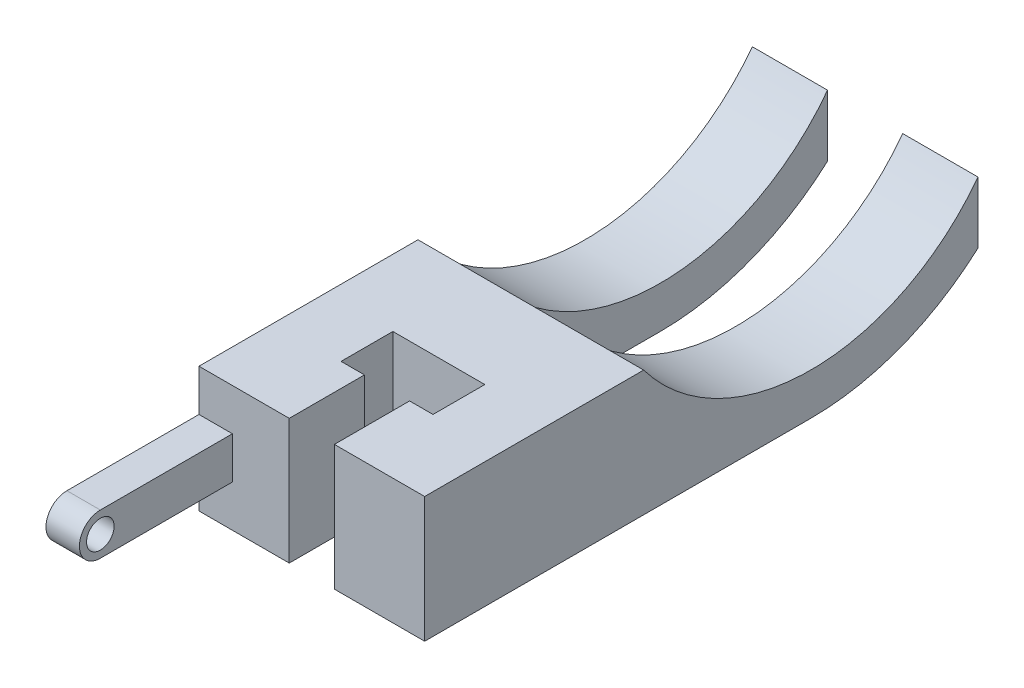
ISO-10303-21;
HEADER;
FILE_DESCRIPTION(('STEP AP214'),'2;1');
FILE_NAME('part.step','',(''),(''),'','','');
FILE_SCHEMA(('AUTOMOTIVE_DESIGN { 1 0 10303 214 1 1 1 1 }'));
ENDSEC;
DATA;
#1=APPLICATION_CONTEXT('core data for automotive mechanical design processes');
#2=APPLICATION_PROTOCOL_DEFINITION('international standard','automotive_design',2000,#1);
#3=PRODUCT_CONTEXT('',#1,'mechanical');
#4=PRODUCT('Part','Part','',(#3));
#5=PRODUCT_RELATED_PRODUCT_CATEGORY('part','',(#4));
#6=PRODUCT_DEFINITION_FORMATION('','',#4);
#7=PRODUCT_DEFINITION_CONTEXT('part definition',#1,'design');
#8=PRODUCT_DEFINITION('design','',#6,#7);
#9=PRODUCT_DEFINITION_SHAPE('','',#8);
#10=(LENGTH_UNIT() NAMED_UNIT(*) SI_UNIT(.MILLI.,.METRE.));
#11=(NAMED_UNIT(*) PLANE_ANGLE_UNIT() SI_UNIT($,.RADIAN.));
#12=(NAMED_UNIT(*) SI_UNIT($,.STERADIAN.) SOLID_ANGLE_UNIT());
#13=UNCERTAINTY_MEASURE_WITH_UNIT(LENGTH_MEASURE(1.E-05),#10,'distance_accuracy_value','');
#14=(GEOMETRIC_REPRESENTATION_CONTEXT(3) GLOBAL_UNCERTAINTY_ASSIGNED_CONTEXT((#13)) GLOBAL_UNIT_ASSIGNED_CONTEXT((#10,
#11,#12)) REPRESENTATION_CONTEXT('',''));
#15=CARTESIAN_POINT('',(0.,0.,0.));
#16=DIRECTION('',(0.,0.,1.));
#17=DIRECTION('',(1.,0.,0.));
#18=AXIS2_PLACEMENT_3D('',#15,#16,#17);
#19=CARTESIAN_POINT('',(-4.5,0.,0.));
#20=DIRECTION('',(-1.,0.,0.));
#21=DIRECTION('',(0.,0.,1.));
#22=AXIS2_PLACEMENT_3D('',#19,#20,#21);
#23=PLANE('',#22);
#24=DIRECTION('',(0.,1.,0.));
#25=VECTOR('',#24,1.);
#26=CARTESIAN_POINT('',(-4.5,0.,-11.));
#27=LINE('',#26,#25);
#28=CARTESIAN_POINT('',(-4.5,0.,-11.));
#29=VERTEX_POINT('',#28);
#30=CARTESIAN_POINT('',(-4.5,15.,-11.));
#31=VERTEX_POINT('',#30);
#32=EDGE_CURVE('E288',#29,#31,#27,.T.);
#33=ORIENTED_EDGE('',*,*,#32,.F.);
#34=DIRECTION('',(0.,0.,-1.));
#35=VECTOR('',#34,1.);
#36=CARTESIAN_POINT('',(-4.5,0.,0.));
#37=LINE('',#36,#35);
#38=CARTESIAN_POINT('',(-4.5,0.,-31.));
#39=VERTEX_POINT('',#38);
#40=EDGE_CURVE('E354',#29,#39,#37,.T.);
#41=ORIENTED_EDGE('',*,*,#40,.T.);
#42=CARTESIAN_POINT('',(-4.5,30.,-31.));
#43=DIRECTION('',(-1.,0.,0.));
#44=DIRECTION('',(0.,0.,1.));
#45=AXIS2_PLACEMENT_3D('',#42,#43,#44);
#46=CIRCLE('',#45,30.);
#47=CARTESIAN_POINT('',(-4.5,7.6393202250021,-51.));
#48=VERTEX_POINT('',#47);
#49=EDGE_CURVE('E350',#48,#39,#46,.T.);
#50=ORIENTED_EDGE('',*,*,#49,.F.);
#51=DIRECTION('',(0.,-1.,0.));
#52=VECTOR('',#51,1.);
#53=CARTESIAN_POINT('',(-4.5,0.,-51.));
#54=LINE('',#53,#52);
#55=CARTESIAN_POINT('',(-4.5,15.,-51.));
#56=VERTEX_POINT('',#55);
#57=EDGE_CURVE('E345',#56,#48,#54,.T.);
#58=ORIENTED_EDGE('',*,*,#57,.F.);
#59=CARTESIAN_POINT('',(-4.5,30.,-31.));
#60=DIRECTION('',(-1.,0.,0.));
#61=DIRECTION('',(0.,0.,1.));
#62=AXIS2_PLACEMENT_3D('',#59,#60,#61);
#63=CIRCLE('',#62,25.);
#64=EDGE_CURVE('E342',#56,#31,#63,.T.);
#65=ORIENTED_EDGE('',*,*,#64,.T.);
#66=EDGE_LOOP('',(#33,#41,#50,#58,#65));
#67=FACE_BOUND('',#66,.T.);
#68=ADVANCED_FACE('F77',(#67),#23,.F.);
#69=CARTESIAN_POINT('',(4.5,30.,-31.));
#70=DIRECTION('',(1.,0.,0.));
#71=DIRECTION('',(0.,0.,-1.));
#72=AXIS2_PLACEMENT_3D('',#69,#70,#71);
#73=PLANE('',#72);
#74=DIRECTION('',(0.,-1.,0.));
#75=VECTOR('',#74,1.);
#76=CARTESIAN_POINT('',(4.5,0.,-11.));
#77=LINE('',#76,#75);
#78=CARTESIAN_POINT('',(4.5,15.,-11.));
#79=VERTEX_POINT('',#78);
#80=CARTESIAN_POINT('',(4.5,0.,-11.));
#81=VERTEX_POINT('',#80);
#82=EDGE_CURVE('E296',#79,#81,#77,.T.);
#83=ORIENTED_EDGE('',*,*,#82,.F.);
#84=CARTESIAN_POINT('',(4.5,30.,-31.));
#85=DIRECTION('',(-1.,0.,0.));
#86=DIRECTION('',(0.,0.,-1.));
#87=AXIS2_PLACEMENT_3D('',#84,#85,#86);
#88=CIRCLE('',#87,25.);
#89=CARTESIAN_POINT('',(4.5,15.,-51.));
#90=VERTEX_POINT('',#89);
#91=EDGE_CURVE('E313',#90,#79,#88,.T.);
#92=ORIENTED_EDGE('',*,*,#91,.F.);
#93=DIRECTION('',(0.,1.,0.));
#94=VECTOR('',#93,1.);
#95=CARTESIAN_POINT('',(4.5,15.,-51.));
#96=LINE('',#95,#94);
#97=CARTESIAN_POINT('',(4.5,7.6393202250021,-51.));
#98=VERTEX_POINT('',#97);
#99=EDGE_CURVE('E309',#98,#90,#96,.T.);
#100=ORIENTED_EDGE('',*,*,#99,.F.);
#101=CARTESIAN_POINT('',(4.5,30.,-31.));
#102=DIRECTION('',(1.,0.,0.));
#103=DIRECTION('',(0.,0.,-1.));
#104=AXIS2_PLACEMENT_3D('',#101,#102,#103);
#105=CIRCLE('',#104,30.);
#106=CARTESIAN_POINT('',(4.5,0.,-31.0000000000003));
#107=VERTEX_POINT('',#106);
#108=EDGE_CURVE('E304',#107,#98,#105,.T.);
#109=ORIENTED_EDGE('',*,*,#108,.F.);
#110=DIRECTION('',(0.,0.,-1.));
#111=VECTOR('',#110,1.);
#112=CARTESIAN_POINT('',(4.5,0.,-3.));
#113=LINE('',#112,#111);
#114=EDGE_CURVE('E301',#81,#107,#113,.T.);
#115=ORIENTED_EDGE('',*,*,#114,.F.);
#116=EDGE_LOOP('',(#83,#92,#100,#109,#115));
#117=FACE_BOUND('',#116,.T.);
#118=ADVANCED_FACE('F546',(#117),#73,.F.);
#119=CARTESIAN_POINT('',(2.7,15.,6.2));
#120=DIRECTION('',(1.,0.,0.));
#121=DIRECTION('',(0.,0.,-1.));
#122=AXIS2_PLACEMENT_3D('',#119,#120,#121);
#123=PLANE('',#122);
#124=DIRECTION('',(0.,0.,1.));
#125=VECTOR('',#124,1.);
#126=CARTESIAN_POINT('',(2.7,0.,6.2));
#127=LINE('',#126,#125);
#128=CARTESIAN_POINT('',(2.7,0.,6.2));
#129=VERTEX_POINT('',#128);
#130=CARTESIAN_POINT('',(2.7,0.,15.2));
#131=VERTEX_POINT('',#130);
#132=EDGE_CURVE('E413',#129,#131,#127,.T.);
#133=ORIENTED_EDGE('',*,*,#132,.T.);
#134=DIRECTION('',(0.,-1.,0.));
#135=VECTOR('',#134,1.);
#136=CARTESIAN_POINT('',(2.7,0.,15.2));
#137=LINE('',#136,#135);
#138=CARTESIAN_POINT('',(2.7,15.,15.2));
#139=VERTEX_POINT('',#138);
#140=EDGE_CURVE('E405',#139,#131,#137,.T.);
#141=ORIENTED_EDGE('',*,*,#140,.F.);
#142=DIRECTION('',(0.,0.,1.));
#143=VECTOR('',#142,1.);
#144=CARTESIAN_POINT('',(2.7,15.,6.2));
#145=LINE('',#144,#143);
#146=CARTESIAN_POINT('',(2.7,15.,6.2));
#147=VERTEX_POINT('',#146);
#148=EDGE_CURVE('E473',#147,#139,#145,.T.);
#149=ORIENTED_EDGE('',*,*,#148,.F.);
#150=DIRECTION('',(0.,-1.,0.));
#151=VECTOR('',#150,1.);
#152=CARTESIAN_POINT('',(2.7,15.,6.2));
#153=LINE('',#152,#151);
#154=EDGE_CURVE('E420',#147,#129,#153,.T.);
#155=ORIENTED_EDGE('',*,*,#154,.T.);
#156=EDGE_LOOP('',(#133,#141,#149,#155));
#157=FACE_BOUND('',#156,.T.);
#158=ADVANCED_FACE('F552',(#157),#123,.F.);
#159=CARTESIAN_POINT('',(5.5,15.,6.2));
#160=DIRECTION('',(0.,0.,1.));
#161=DIRECTION('',(1.,0.,0.));
#162=AXIS2_PLACEMENT_3D('',#159,#160,#161);
#163=PLANE('',#162);
#164=DIRECTION('',(-1.,0.,0.));
#165=VECTOR('',#164,1.);
#166=CARTESIAN_POINT('',(5.5,0.,6.2));
#167=LINE('',#166,#165);
#168=CARTESIAN_POINT('',(5.5,0.,6.2));
#169=VERTEX_POINT('',#168);
#170=EDGE_CURVE('E419',#169,#129,#167,.T.);
#171=ORIENTED_EDGE('',*,*,#170,.T.);
#172=ORIENTED_EDGE('',*,*,#154,.F.);
#173=DIRECTION('',(-1.,0.,0.));
#174=VECTOR('',#173,1.);
#175=CARTESIAN_POINT('',(5.5,15.,6.2));
#176=LINE('',#175,#174);
#177=CARTESIAN_POINT('',(5.5,15.,6.2));
#178=VERTEX_POINT('',#177);
#179=EDGE_CURVE('E476',#178,#147,#176,.T.);
#180=ORIENTED_EDGE('',*,*,#179,.F.);
#181=DIRECTION('',(0.,-1.,0.));
#182=VECTOR('',#181,1.);
#183=CARTESIAN_POINT('',(5.5,15.,6.2));
#184=LINE('',#183,#182);
#185=EDGE_CURVE('E414',#178,#169,#184,.T.);
#186=ORIENTED_EDGE('',*,*,#185,.T.);
#187=EDGE_LOOP('',(#171,#172,#180,#186));
#188=FACE_BOUND('',#187,.T.);
#189=ADVANCED_FACE('F580',(#188),#163,.F.);
#190=CARTESIAN_POINT('',(5.5,15.,0.));
#191=DIRECTION('',(1.,0.,0.));
#192=DIRECTION('',(0.,0.,-1.));
#193=AXIS2_PLACEMENT_3D('',#190,#191,#192);
#194=PLANE('',#193);
#195=DIRECTION('',(0.,0.,1.));
#196=VECTOR('',#195,1.);
#197=CARTESIAN_POINT('',(5.5,0.,0.));
#198=LINE('',#197,#196);
#199=CARTESIAN_POINT('',(5.5,0.,0.));
#200=VERTEX_POINT('',#199);
#201=EDGE_CURVE('E418',#200,#169,#198,.T.);
#202=ORIENTED_EDGE('',*,*,#201,.T.);
#203=ORIENTED_EDGE('',*,*,#185,.F.);
#204=DIRECTION('',(0.,0.,1.));
#205=VECTOR('',#204,1.);
#206=CARTESIAN_POINT('',(5.5,15.,0.));
#207=LINE('',#206,#205);
#208=CARTESIAN_POINT('',(5.5,15.,0.));
#209=VERTEX_POINT('',#208);
#210=EDGE_CURVE('E462',#209,#178,#207,.T.);
#211=ORIENTED_EDGE('',*,*,#210,.F.);
#212=DIRECTION('',(0.,-1.,0.));
#213=VECTOR('',#212,1.);
#214=CARTESIAN_POINT('',(5.5,15.,0.));
#215=LINE('',#214,#213);
#216=EDGE_CURVE('E440',#209,#200,#215,.T.);
#217=ORIENTED_EDGE('',*,*,#216,.T.);
#218=EDGE_LOOP('',(#202,#203,#211,#217));
#219=FACE_BOUND('',#218,.T.);
#220=ADVANCED_FACE('F576',(#219),#194,.F.);
#221=CARTESIAN_POINT('',(-5.5,15.,0.));
#222=DIRECTION('',(0.,0.,-1.));
#223=DIRECTION('',(-1.,0.,0.));
#224=AXIS2_PLACEMENT_3D('',#221,#222,#223);
#225=PLANE('',#224);
#226=DIRECTION('',(1.,0.,0.));
#227=VECTOR('',#226,1.);
#228=CARTESIAN_POINT('',(-5.5,0.,0.));
#229=LINE('',#228,#227);
#230=CARTESIAN_POINT('',(-5.5,0.,0.));
#231=VERTEX_POINT('',#230);
#232=EDGE_CURVE('E439',#231,#200,#229,.T.);
#233=ORIENTED_EDGE('',*,*,#232,.T.);
#234=ORIENTED_EDGE('',*,*,#216,.F.);
#235=DIRECTION('',(1.,0.,0.));
#236=VECTOR('',#235,1.);
#237=CARTESIAN_POINT('',(-5.5,15.,0.));
#238=LINE('',#237,#236);
#239=CARTESIAN_POINT('',(-5.5,15.,0.));
#240=VERTEX_POINT('',#239);
#241=EDGE_CURVE('E459',#240,#209,#238,.T.);
#242=ORIENTED_EDGE('',*,*,#241,.F.);
#243=DIRECTION('',(0.,-1.,0.));
#244=VECTOR('',#243,1.);
#245=CARTESIAN_POINT('',(-5.5,15.,0.));
#246=LINE('',#245,#244);
#247=EDGE_CURVE('E435',#240,#231,#246,.T.);
#248=ORIENTED_EDGE('',*,*,#247,.T.);
#249=EDGE_LOOP('',(#233,#234,#242,#248));
#250=FACE_BOUND('',#249,.T.);
#251=ADVANCED_FACE('F579',(#250),#225,.F.);
#252=CARTESIAN_POINT('',(-5.5,15.,0.));
#253=DIRECTION('',(-1.,0.,0.));
#254=DIRECTION('',(0.,0.,1.));
#255=AXIS2_PLACEMENT_3D('',#252,#253,#254);
#256=PLANE('',#255);
#257=DIRECTION('',(0.,0.,-1.));
#258=VECTOR('',#257,1.);
#259=CARTESIAN_POINT('',(-5.5,0.,0.));
#260=LINE('',#259,#258);
#261=CARTESIAN_POINT('',(-5.5,0.,6.2));
#262=VERTEX_POINT('',#261);
#263=EDGE_CURVE('E434',#262,#231,#260,.T.);
#264=ORIENTED_EDGE('',*,*,#263,.T.);
#265=ORIENTED_EDGE('',*,*,#247,.F.);
#266=DIRECTION('',(0.,0.,-1.));
#267=VECTOR('',#266,1.);
#268=CARTESIAN_POINT('',(-5.5,15.,0.));
#269=LINE('',#268,#267);
#270=CARTESIAN_POINT('',(-5.5,15.,6.2));
#271=VERTEX_POINT('',#270);
#272=EDGE_CURVE('E463',#271,#240,#269,.T.);
#273=ORIENTED_EDGE('',*,*,#272,.F.);
#274=DIRECTION('',(0.,-1.,0.));
#275=VECTOR('',#274,1.);
#276=CARTESIAN_POINT('',(-5.5,15.,6.2));
#277=LINE('',#276,#275);
#278=EDGE_CURVE('E430',#271,#262,#277,.T.);
#279=ORIENTED_EDGE('',*,*,#278,.T.);
#280=EDGE_LOOP('',(#264,#265,#273,#279));
#281=FACE_BOUND('',#280,.T.);
#282=ADVANCED_FACE('F592',(#281),#256,.F.);
#283=CARTESIAN_POINT('',(-5.5,15.,6.2));
#284=DIRECTION('',(0.,0.,1.));
#285=DIRECTION('',(1.,0.,0.));
#286=AXIS2_PLACEMENT_3D('',#283,#284,#285);
#287=PLANE('',#286);
#288=DIRECTION('',(-1.,0.,0.));
#289=VECTOR('',#288,1.);
#290=CARTESIAN_POINT('',(-5.5,0.,6.2));
#291=LINE('',#290,#289);
#292=CARTESIAN_POINT('',(-2.7,0.,6.2));
#293=VERTEX_POINT('',#292);
#294=EDGE_CURVE('E429',#293,#262,#291,.T.);
#295=ORIENTED_EDGE('',*,*,#294,.T.);
#296=ORIENTED_EDGE('',*,*,#278,.F.);
#297=DIRECTION('',(-1.,0.,0.));
#298=VECTOR('',#297,1.);
#299=CARTESIAN_POINT('',(-5.5,15.,6.2));
#300=LINE('',#299,#298);
#301=CARTESIAN_POINT('',(-2.7,15.,6.2));
#302=VERTEX_POINT('',#301);
#303=EDGE_CURVE('E466',#302,#271,#300,.T.);
#304=ORIENTED_EDGE('',*,*,#303,.F.);
#305=DIRECTION('',(0.,-1.,0.));
#306=VECTOR('',#305,1.);
#307=CARTESIAN_POINT('',(-2.7,15.,6.2));
#308=LINE('',#307,#306);
#309=EDGE_CURVE('E424',#302,#293,#308,.T.);
#310=ORIENTED_EDGE('',*,*,#309,.T.);
#311=EDGE_LOOP('',(#295,#296,#304,#310));
#312=FACE_BOUND('',#311,.T.);
#313=ADVANCED_FACE('F527',(#312),#287,.F.);
#314=CARTESIAN_POINT('',(-2.7,15.,6.2));
#315=DIRECTION('',(-1.,0.,0.));
#316=DIRECTION('',(0.,0.,1.));
#317=AXIS2_PLACEMENT_3D('',#314,#315,#316);
#318=PLANE('',#317);
#319=DIRECTION('',(0.,0.,-1.));
#320=VECTOR('',#319,1.);
#321=CARTESIAN_POINT('',(-2.7,0.,6.2));
#322=LINE('',#321,#320);
#323=CARTESIAN_POINT('',(-2.7,0.,15.2));
#324=VERTEX_POINT('',#323);
#325=EDGE_CURVE('E428',#324,#293,#322,.T.);
#326=ORIENTED_EDGE('',*,*,#325,.T.);
#327=ORIENTED_EDGE('',*,*,#309,.F.);
#328=DIRECTION('',(0.,0.,-1.));
#329=VECTOR('',#328,1.);
#330=CARTESIAN_POINT('',(-2.7,15.,6.2));
#331=LINE('',#330,#329);
#332=CARTESIAN_POINT('',(-2.7,15.,15.2));
#333=VERTEX_POINT('',#332);
#334=EDGE_CURVE('E469',#333,#302,#331,.T.);
#335=ORIENTED_EDGE('',*,*,#334,.F.);
#336=DIRECTION('',(0.,1.,0.));
#337=VECTOR('',#336,1.);
#338=CARTESIAN_POINT('',(-2.7,15.,15.2));
#339=LINE('',#338,#337);
#340=EDGE_CURVE('E393',#324,#333,#339,.T.);
#341=ORIENTED_EDGE('',*,*,#340,.F.);
#342=EDGE_LOOP('',(#326,#327,#335,#341));
#343=FACE_BOUND('',#342,.T.);
#344=ADVANCED_FACE('F524',(#343),#318,.F.);
#345=CARTESIAN_POINT('',(0.,15.,0.));
#346=DIRECTION('',(0.,-1.,0.));
#347=DIRECTION('',(0.,0.,-1.));
#348=AXIS2_PLACEMENT_3D('',#345,#346,#347);
#349=PLANE('',#348);
#350=DIRECTION('',(1.,0.,0.));
#351=VECTOR('',#350,1.);
#352=CARTESIAN_POINT('',(-4.5,15.,-11.));
#353=LINE('',#352,#351);
#354=EDGE_CURVE('E292',#31,#79,#353,.T.);
#355=ORIENTED_EDGE('',*,*,#354,.F.);
#356=DIRECTION('',(-1.,0.,0.));
#357=VECTOR('',#356,1.);
#358=CARTESIAN_POINT('',(-4.5,15.,-11.));
#359=LINE('',#358,#357);
#360=CARTESIAN_POINT('',(-13.5,15.,-11.));
#361=VERTEX_POINT('',#360);
#362=EDGE_CURVE('E368',#31,#361,#359,.T.);
#363=ORIENTED_EDGE('',*,*,#362,.T.);
#364=DIRECTION('',(0.,0.,1.));
#365=VECTOR('',#364,1.);
#366=CARTESIAN_POINT('',(-13.5,15.,0.));
#367=LINE('',#366,#365);
#368=CARTESIAN_POINT('',(-13.5,15.,15.2));
#369=VERTEX_POINT('',#368);
#370=EDGE_CURVE('E472',#361,#369,#367,.T.);
#371=ORIENTED_EDGE('',*,*,#370,.T.);
#372=DIRECTION('',(-1.,0.,0.));
#373=VECTOR('',#372,1.);
#374=CARTESIAN_POINT('',(-2.7,15.,15.2));
#375=LINE('',#374,#373);
#376=EDGE_CURVE('E372',#333,#369,#375,.T.);
#377=ORIENTED_EDGE('',*,*,#376,.F.);
#378=ORIENTED_EDGE('',*,*,#334,.T.);
#379=ORIENTED_EDGE('',*,*,#303,.T.);
#380=ORIENTED_EDGE('',*,*,#272,.T.);
#381=ORIENTED_EDGE('',*,*,#241,.T.);
#382=ORIENTED_EDGE('',*,*,#210,.T.);
#383=ORIENTED_EDGE('',*,*,#179,.T.);
#384=ORIENTED_EDGE('',*,*,#148,.T.);
#385=DIRECTION('',(-1.,0.,0.));
#386=VECTOR('',#385,1.);
#387=CARTESIAN_POINT('',(13.5,15.,15.2));
#388=LINE('',#387,#386);
#389=CARTESIAN_POINT('',(13.5,15.,15.2));
#390=VERTEX_POINT('',#389);
#391=EDGE_CURVE('E401',#390,#139,#388,.T.);
#392=ORIENTED_EDGE('',*,*,#391,.F.);
#393=DIRECTION('',(0.,0.,-1.));
#394=VECTOR('',#393,1.);
#395=CARTESIAN_POINT('',(13.5,15.,0.));
#396=LINE('',#395,#394);
#397=CARTESIAN_POINT('',(13.5,15.,-11.));
#398=VERTEX_POINT('',#397);
#399=EDGE_CURVE('E81',#390,#398,#396,.T.);
#400=ORIENTED_EDGE('',*,*,#399,.T.);
#401=DIRECTION('',(1.,0.,0.));
#402=VECTOR('',#401,1.);
#403=CARTESIAN_POINT('',(4.5,15.,-11.));
#404=LINE('',#403,#402);
#405=EDGE_CURVE('E328',#79,#398,#404,.T.);
#406=ORIENTED_EDGE('',*,*,#405,.F.);
#407=EDGE_LOOP('',(#355,#363,#371,#377,#378,#379,#380,#381,#382,#383,#384,#392,#400,#406));
#408=FACE_BOUND('',#407,.T.);
#409=ADVANCED_FACE('F508',(#408),#349,.F.);
#410=CARTESIAN_POINT('',(0.,0.,0.));
#411=DIRECTION('',(0.,-1.,0.));
#412=DIRECTION('',(0.,0.,-1.));
#413=AXIS2_PLACEMENT_3D('',#410,#411,#412);
#414=PLANE('',#413);
#415=ORIENTED_EDGE('',*,*,#40,.F.);
#416=DIRECTION('',(-1.,0.,0.));
#417=VECTOR('',#416,1.);
#418=CARTESIAN_POINT('',(-4.5,0.,-11.));
#419=LINE('',#418,#417);
#420=EDGE_CURVE('E279',#81,#29,#419,.T.);
#421=ORIENTED_EDGE('',*,*,#420,.F.);
#422=ORIENTED_EDGE('',*,*,#114,.T.);
#423=DIRECTION('',(1.,0.,0.));
#424=VECTOR('',#423,1.);
#425=CARTESIAN_POINT('',(4.5,0.,-31.0000000000003));
#426=LINE('',#425,#424);
#427=CARTESIAN_POINT('',(13.5,0.,-31.0000000000003));
#428=VERTEX_POINT('',#427);
#429=EDGE_CURVE('E317',#107,#428,#426,.T.);
#430=ORIENTED_EDGE('',*,*,#429,.T.);
#431=DIRECTION('',(0.,0.,-1.));
#432=VECTOR('',#431,1.);
#433=CARTESIAN_POINT('',(13.5,0.,0.));
#434=LINE('',#433,#432);
#435=CARTESIAN_POINT('',(13.5,0.,15.2));
#436=VERTEX_POINT('',#435);
#437=EDGE_CURVE('E87',#436,#428,#434,.T.);
#438=ORIENTED_EDGE('',*,*,#437,.F.);
#439=DIRECTION('',(1.,0.,0.));
#440=VECTOR('',#439,1.);
#441=CARTESIAN_POINT('',(13.5,0.,15.2));
#442=LINE('',#441,#440);
#443=EDGE_CURVE('E409',#131,#436,#442,.T.);
#444=ORIENTED_EDGE('',*,*,#443,.F.);
#445=ORIENTED_EDGE('',*,*,#132,.F.);
#446=ORIENTED_EDGE('',*,*,#170,.F.);
#447=ORIENTED_EDGE('',*,*,#201,.F.);
#448=ORIENTED_EDGE('',*,*,#232,.F.);
#449=ORIENTED_EDGE('',*,*,#263,.F.);
#450=ORIENTED_EDGE('',*,*,#294,.F.);
#451=ORIENTED_EDGE('',*,*,#325,.F.);
#452=DIRECTION('',(1.,0.,0.));
#453=VECTOR('',#452,1.);
#454=CARTESIAN_POINT('',(-2.7,0.,15.2));
#455=LINE('',#454,#453);
#456=CARTESIAN_POINT('',(-13.5,0.,15.2));
#457=VERTEX_POINT('',#456);
#458=EDGE_CURVE('E389',#457,#324,#455,.T.);
#459=ORIENTED_EDGE('',*,*,#458,.F.);
#460=DIRECTION('',(0.,0.,1.));
#461=VECTOR('',#460,1.);
#462=CARTESIAN_POINT('',(-13.5,0.,0.));
#463=LINE('',#462,#461);
#464=CARTESIAN_POINT('',(-13.5,0.,-31.));
#465=VERTEX_POINT('',#464);
#466=EDGE_CURVE('E12',#465,#457,#463,.T.);
#467=ORIENTED_EDGE('',*,*,#466,.F.);
#468=DIRECTION('',(-1.,0.,0.));
#469=VECTOR('',#468,1.);
#470=CARTESIAN_POINT('',(-4.5,0.,-31.));
#471=LINE('',#470,#469);
#472=EDGE_CURVE('E373',#39,#465,#471,.T.);
#473=ORIENTED_EDGE('',*,*,#472,.F.);
#474=EDGE_LOOP('',(#415,#421,#422,#430,#438,#444,#445,#446,#447,#448,#449,#450,#451,#459,#467,#473));
#475=FACE_BOUND('',#474,.T.);
#476=ADVANCED_FACE('F492',(#475),#414,.T.);
#477=CARTESIAN_POINT('',(13.5,15.,0.));
#478=DIRECTION('',(-1.,0.,0.));
#479=DIRECTION('',(0.,0.,1.));
#480=AXIS2_PLACEMENT_3D('',#477,#478,#479);
#481=PLANE('',#480);
#482=DIRECTION('',(0.,1.,0.));
#483=VECTOR('',#482,1.);
#484=CARTESIAN_POINT('',(13.5,0.,15.2));
#485=LINE('',#484,#483);
#486=EDGE_CURVE('E397',#436,#390,#485,.T.);
#487=ORIENTED_EDGE('',*,*,#486,.F.);
#488=ORIENTED_EDGE('',*,*,#437,.T.);
#489=CARTESIAN_POINT('',(13.5,30.,-31.));
#490=DIRECTION('',(1.,0.,0.));
#491=DIRECTION('',(0.,0.,-1.));
#492=AXIS2_PLACEMENT_3D('',#489,#490,#491);
#493=CIRCLE('',#492,30.);
#494=CARTESIAN_POINT('',(13.5,7.6393202250021,-51.));
#495=VERTEX_POINT('',#494);
#496=EDGE_CURVE('E300',#428,#495,#493,.T.);
#497=ORIENTED_EDGE('',*,*,#496,.T.);
#498=DIRECTION('',(0.,1.,0.));
#499=VECTOR('',#498,1.);
#500=CARTESIAN_POINT('',(13.5,15.,-51.));
#501=LINE('',#500,#499);
#502=CARTESIAN_POINT('',(13.5,15.,-51.));
#503=VERTEX_POINT('',#502);
#504=EDGE_CURVE('E321',#495,#503,#501,.T.);
#505=ORIENTED_EDGE('',*,*,#504,.T.);
#506=CARTESIAN_POINT('',(13.5,30.,-31.));
#507=DIRECTION('',(-1.,0.,0.));
#508=DIRECTION('',(0.,0.,-1.));
#509=AXIS2_PLACEMENT_3D('',#506,#507,#508);
#510=CIRCLE('',#509,25.);
#511=EDGE_CURVE('E305',#503,#398,#510,.T.);
#512=ORIENTED_EDGE('',*,*,#511,.T.);
#513=ORIENTED_EDGE('',*,*,#399,.F.);
#514=EDGE_LOOP('',(#487,#488,#497,#505,#512,#513));
#515=FACE_BOUND('',#514,.T.);
#516=ADVANCED_FACE('F486',(#515),#481,.F.);
#517=CARTESIAN_POINT('',(-13.5,15.,0.));
#518=DIRECTION('',(1.,0.,0.));
#519=DIRECTION('',(0.,0.,-1.));
#520=AXIS2_PLACEMENT_3D('',#517,#518,#519);
#521=PLANE('',#520);
#522=ORIENTED_EDGE('',*,*,#370,.F.);
#523=CARTESIAN_POINT('',(-13.5,30.,-31.));
#524=DIRECTION('',(-1.,0.,0.));
#525=DIRECTION('',(0.,0.,1.));
#526=AXIS2_PLACEMENT_3D('',#523,#524,#525);
#527=CIRCLE('',#526,25.);
#528=CARTESIAN_POINT('',(-13.5,15.,-51.));
#529=VERTEX_POINT('',#528);
#530=EDGE_CURVE('E332',#529,#361,#527,.T.);
#531=ORIENTED_EDGE('',*,*,#530,.F.);
#532=DIRECTION('',(0.,-1.,0.));
#533=VECTOR('',#532,1.);
#534=CARTESIAN_POINT('',(-13.5,0.,-51.));
#535=LINE('',#534,#533);
#536=CARTESIAN_POINT('',(-13.5,7.6393202250021,-51.));
#537=VERTEX_POINT('',#536);
#538=EDGE_CURVE('E361',#529,#537,#535,.T.);
#539=ORIENTED_EDGE('',*,*,#538,.T.);
#540=CARTESIAN_POINT('',(-13.5,30.,-31.));
#541=DIRECTION('',(-1.,0.,0.));
#542=DIRECTION('',(0.,0.,1.));
#543=AXIS2_PLACEMENT_3D('',#540,#541,#542);
#544=CIRCLE('',#543,30.);
#545=EDGE_CURVE('E346',#537,#465,#544,.T.);
#546=ORIENTED_EDGE('',*,*,#545,.T.);
#547=ORIENTED_EDGE('',*,*,#466,.T.);
#548=DIRECTION('',(0.,-1.,0.));
#549=VECTOR('',#548,1.);
#550=CARTESIAN_POINT('',(-13.5,15.,15.2));
#551=LINE('',#550,#549);
#552=CARTESIAN_POINT('',(-13.5,5.,15.2));
#553=VERTEX_POINT('',#552);
#554=EDGE_CURVE('E385',#553,#457,#551,.T.);
#555=ORIENTED_EDGE('',*,*,#554,.F.);
#556=DIRECTION('',(0.,0.,1.));
#557=VECTOR('',#556,1.);
#558=CARTESIAN_POINT('',(-13.5,5.,15.2));
#559=LINE('',#558,#557);
#560=CARTESIAN_POINT('',(-13.5,5.,31.));
#561=VERTEX_POINT('',#560);
#562=EDGE_CURVE('E258',#553,#561,#559,.T.);
#563=ORIENTED_EDGE('',*,*,#562,.T.);
#564=CARTESIAN_POINT('',(-13.5,7.5,31.));
#565=DIRECTION('',(-1.,0.,0.));
#566=DIRECTION('',(0.,0.,1.));
#567=AXIS2_PLACEMENT_3D('',#564,#565,#566);
#568=CIRCLE('',#567,2.5);
#569=CARTESIAN_POINT('',(-13.5,10.,31.));
#570=VERTEX_POINT('',#569);
#571=EDGE_CURVE('E271',#561,#570,#568,.T.);
#572=ORIENTED_EDGE('',*,*,#571,.T.);
#573=DIRECTION('',(0.,0.,-1.));
#574=VECTOR('',#573,1.);
#575=CARTESIAN_POINT('',(-13.5,10.,31.));
#576=LINE('',#575,#574);
#577=CARTESIAN_POINT('',(-13.5,10.,15.2));
#578=VERTEX_POINT('',#577);
#579=EDGE_CURVE('E239',#570,#578,#576,.T.);
#580=ORIENTED_EDGE('',*,*,#579,.T.);
#581=EDGE_CURVE('E386',#369,#578,#551,.T.);
#582=ORIENTED_EDGE('',*,*,#581,.F.);
#583=EDGE_LOOP('',(#522,#531,#539,#546,#547,#555,#563,#572,#580,#582));
#584=FACE_BOUND('',#583,.T.);
#585=CARTESIAN_POINT('',(-13.5,7.5,31.));
#586=DIRECTION('',(-1.,0.,0.));
#587=DIRECTION('',(0.,0.,1.));
#588=AXIS2_PLACEMENT_3D('',#585,#586,#587);
#589=CIRCLE('',#588,1.65);
#590=CARTESIAN_POINT('',(-13.5,7.5,32.65));
#591=VERTEX_POINT('',#590);
#592=EDGE_CURVE('E264',#591,#591,#589,.T.);
#593=ORIENTED_EDGE('',*,*,#592,.F.);
#594=EDGE_LOOP('',(#593));
#595=FACE_BOUND('',#594,.T.);
#596=ADVANCED_FACE('F79',(#584,#595),#521,.F.);
#597=CARTESIAN_POINT('',(0.,0.,15.2));
#598=DIRECTION('',(0.,0.,1.));
#599=DIRECTION('',(1.,0.,0.));
#600=AXIS2_PLACEMENT_3D('',#597,#598,#599);
#601=PLANE('',#600);
#602=ORIENTED_EDGE('',*,*,#443,.T.);
#603=ORIENTED_EDGE('',*,*,#486,.T.);
#604=ORIENTED_EDGE('',*,*,#391,.T.);
#605=ORIENTED_EDGE('',*,*,#140,.T.);
#606=EDGE_LOOP('',(#602,#603,#604,#605));
#607=FACE_BOUND('',#606,.T.);
#608=ADVANCED_FACE('F572',(#607),#601,.T.);
#609=CARTESIAN_POINT('',(0.,0.,15.2));
#610=DIRECTION('',(0.,0.,1.));
#611=DIRECTION('',(1.,0.,0.));
#612=AXIS2_PLACEMENT_3D('',#609,#610,#611);
#613=PLANE('',#612);
#614=DIRECTION('',(-1.,0.,0.));
#615=VECTOR('',#614,1.);
#616=CARTESIAN_POINT('',(-9.5,5.,15.2));
#617=LINE('',#616,#615);
#618=CARTESIAN_POINT('',(-9.5,5.,15.2));
#619=VERTEX_POINT('',#618);
#620=EDGE_CURVE('E280',#619,#553,#617,.T.);
#621=ORIENTED_EDGE('',*,*,#620,.T.);
#622=ORIENTED_EDGE('',*,*,#554,.T.);
#623=ORIENTED_EDGE('',*,*,#458,.T.);
#624=ORIENTED_EDGE('',*,*,#340,.T.);
#625=ORIENTED_EDGE('',*,*,#376,.T.);
#626=ORIENTED_EDGE('',*,*,#581,.T.);
#627=DIRECTION('',(-1.,0.,0.));
#628=VECTOR('',#627,1.);
#629=CARTESIAN_POINT('',(-9.5,10.,15.2));
#630=LINE('',#629,#628);
#631=CARTESIAN_POINT('',(-9.5,10.,15.2));
#632=VERTEX_POINT('',#631);
#633=EDGE_CURVE('E100',#632,#578,#630,.T.);
#634=ORIENTED_EDGE('',*,*,#633,.F.);
#635=DIRECTION('',(0.,-1.,0.));
#636=VECTOR('',#635,1.);
#637=CARTESIAN_POINT('',(-9.5,10.,15.2));
#638=LINE('',#637,#636);
#639=EDGE_CURVE('E95',#632,#619,#638,.T.);
#640=ORIENTED_EDGE('',*,*,#639,.T.);
#641=EDGE_LOOP('',(#621,#622,#623,#624,#625,#626,#634,#640));
#642=FACE_BOUND('',#641,.T.);
#643=ADVANCED_FACE('F512',(#642),#613,.T.);
#644=CARTESIAN_POINT('',(-4.5,30.,-31.));
#645=DIRECTION('',(-1.,0.,0.));
#646=DIRECTION('',(0.,0.,1.));
#647=AXIS2_PLACEMENT_3D('',#644,#645,#646);
#648=CYLINDRICAL_SURFACE('',#647,25.);
#649=ORIENTED_EDGE('',*,*,#530,.T.);
#650=ORIENTED_EDGE('',*,*,#362,.F.);
#651=ORIENTED_EDGE('',*,*,#64,.F.);
#652=DIRECTION('',(-1.,0.,0.));
#653=VECTOR('',#652,1.);
#654=CARTESIAN_POINT('',(-4.5,15.,-51.));
#655=LINE('',#654,#653);
#656=EDGE_CURVE('E357',#56,#529,#655,.T.);
#657=ORIENTED_EDGE('',*,*,#656,.T.);
#658=EDGE_LOOP('',(#649,#650,#651,#657));
#659=FACE_BOUND('',#658,.T.);
#660=ADVANCED_FACE('F562',(#659),#648,.F.);
#661=CARTESIAN_POINT('',(-4.5,30.,-31.));
#662=DIRECTION('',(-1.,0.,0.));
#663=DIRECTION('',(0.,0.,1.));
#664=AXIS2_PLACEMENT_3D('',#661,#662,#663);
#665=CYLINDRICAL_SURFACE('',#664,30.);
#666=ORIENTED_EDGE('',*,*,#545,.F.);
#667=DIRECTION('',(-1.,0.,0.));
#668=VECTOR('',#667,1.);
#669=CARTESIAN_POINT('',(-4.5,7.6393202250021,-51.));
#670=LINE('',#669,#668);
#671=EDGE_CURVE('E377',#48,#537,#670,.T.);
#672=ORIENTED_EDGE('',*,*,#671,.F.);
#673=ORIENTED_EDGE('',*,*,#49,.T.);
#674=ORIENTED_EDGE('',*,*,#472,.T.);
#675=EDGE_LOOP('',(#666,#672,#673,#674));
#676=FACE_BOUND('',#675,.T.);
#677=ADVANCED_FACE('F558',(#676),#665,.T.);
#678=CARTESIAN_POINT('',(-4.5,0.,-51.));
#679=DIRECTION('',(0.,0.,-1.));
#680=DIRECTION('',(-1.,0.,0.));
#681=AXIS2_PLACEMENT_3D('',#678,#679,#680);
#682=PLANE('',#681);
#683=ORIENTED_EDGE('',*,*,#538,.F.);
#684=ORIENTED_EDGE('',*,*,#656,.F.);
#685=ORIENTED_EDGE('',*,*,#57,.T.);
#686=ORIENTED_EDGE('',*,*,#671,.T.);
#687=EDGE_LOOP('',(#683,#684,#685,#686));
#688=FACE_BOUND('',#687,.T.);
#689=ADVANCED_FACE('F561',(#688),#682,.T.);
#690=CARTESIAN_POINT('',(4.5,30.,-31.));
#691=DIRECTION('',(1.,0.,0.));
#692=DIRECTION('',(0.,0.,-1.));
#693=AXIS2_PLACEMENT_3D('',#690,#691,#692);
#694=CYLINDRICAL_SURFACE('',#693,25.);
#695=ORIENTED_EDGE('',*,*,#511,.F.);
#696=DIRECTION('',(1.,0.,0.));
#697=VECTOR('',#696,1.);
#698=CARTESIAN_POINT('',(4.5,15.,-51.));
#699=LINE('',#698,#697);
#700=EDGE_CURVE('E333',#90,#503,#699,.T.);
#701=ORIENTED_EDGE('',*,*,#700,.F.);
#702=ORIENTED_EDGE('',*,*,#91,.T.);
#703=ORIENTED_EDGE('',*,*,#405,.T.);
#704=EDGE_LOOP('',(#695,#701,#702,#703));
#705=FACE_BOUND('',#704,.T.);
#706=ADVANCED_FACE('F503',(#705),#694,.F.);
#707=CARTESIAN_POINT('',(4.5,15.,-51.));
#708=DIRECTION('',(0.,0.,-1.));
#709=DIRECTION('',(-1.,0.,0.));
#710=AXIS2_PLACEMENT_3D('',#707,#708,#709);
#711=PLANE('',#710);
#712=ORIENTED_EDGE('',*,*,#504,.F.);
#713=DIRECTION('',(1.,0.,0.));
#714=VECTOR('',#713,1.);
#715=CARTESIAN_POINT('',(4.5,7.6393202250021,-51.));
#716=LINE('',#715,#714);
#717=EDGE_CURVE('E336',#98,#495,#716,.T.);
#718=ORIENTED_EDGE('',*,*,#717,.F.);
#719=ORIENTED_EDGE('',*,*,#99,.T.);
#720=ORIENTED_EDGE('',*,*,#700,.T.);
#721=EDGE_LOOP('',(#712,#718,#719,#720));
#722=FACE_BOUND('',#721,.T.);
#723=ADVANCED_FACE('F500',(#722),#711,.T.);
#724=CARTESIAN_POINT('',(4.5,30.,-31.));
#725=DIRECTION('',(1.,0.,0.));
#726=DIRECTION('',(0.,0.,-1.));
#727=AXIS2_PLACEMENT_3D('',#724,#725,#726);
#728=CYLINDRICAL_SURFACE('',#727,30.);
#729=ORIENTED_EDGE('',*,*,#496,.F.);
#730=ORIENTED_EDGE('',*,*,#429,.F.);
#731=ORIENTED_EDGE('',*,*,#108,.T.);
#732=ORIENTED_EDGE('',*,*,#717,.T.);
#733=EDGE_LOOP('',(#729,#730,#731,#732));
#734=FACE_BOUND('',#733,.T.);
#735=ADVANCED_FACE('F496',(#734),#728,.T.);
#736=CARTESIAN_POINT('',(0.,0.,-11.));
#737=DIRECTION('',(0.,0.,1.));
#738=DIRECTION('',(1.,0.,0.));
#739=AXIS2_PLACEMENT_3D('',#736,#737,#738);
#740=PLANE('',#739);
#741=ORIENTED_EDGE('',*,*,#420,.T.);
#742=ORIENTED_EDGE('',*,*,#32,.T.);
#743=ORIENTED_EDGE('',*,*,#354,.T.);
#744=ORIENTED_EDGE('',*,*,#82,.T.);
#745=EDGE_LOOP('',(#741,#742,#743,#744));
#746=FACE_BOUND('',#745,.T.);
#747=ADVANCED_FACE('F542',(#746),#740,.F.);
#748=CARTESIAN_POINT('',(-9.5,7.5,31.));
#749=DIRECTION('',(-1.,0.,0.));
#750=DIRECTION('',(0.,0.,1.));
#751=AXIS2_PLACEMENT_3D('',#748,#749,#750);
#752=CYLINDRICAL_SURFACE('',#751,2.5);
#753=ORIENTED_EDGE('',*,*,#571,.F.);
#754=DIRECTION('',(-1.,0.,0.));
#755=VECTOR('',#754,1.);
#756=CARTESIAN_POINT('',(-9.5,5.,31.));
#757=LINE('',#756,#755);
#758=CARTESIAN_POINT('',(-9.5,5.,31.));
#759=VERTEX_POINT('',#758);
#760=EDGE_CURVE('E256',#759,#561,#757,.T.);
#761=ORIENTED_EDGE('',*,*,#760,.F.);
#762=CARTESIAN_POINT('',(-9.5,7.5,31.));
#763=DIRECTION('',(-1.,0.,0.));
#764=DIRECTION('',(0.,0.,1.));
#765=AXIS2_PLACEMENT_3D('',#762,#763,#764);
#766=CIRCLE('',#765,2.5);
#767=CARTESIAN_POINT('',(-9.5,10.,31.));
#768=VERTEX_POINT('',#767);
#769=EDGE_CURVE('E251',#759,#768,#766,.T.);
#770=ORIENTED_EDGE('',*,*,#769,.T.);
#771=DIRECTION('',(-1.,0.,0.));
#772=VECTOR('',#771,1.);
#773=CARTESIAN_POINT('',(-9.5,10.,31.));
#774=LINE('',#773,#772);
#775=EDGE_CURVE('E234',#768,#570,#774,.T.);
#776=ORIENTED_EDGE('',*,*,#775,.T.);
#777=EDGE_LOOP('',(#753,#761,#770,#776));
#778=FACE_BOUND('',#777,.T.);
#779=ADVANCED_FACE('F255',(#778),#752,.T.);
#780=CARTESIAN_POINT('',(-9.5,5.,15.2));
#781=DIRECTION('',(0.,-1.,0.));
#782=DIRECTION('',(0.,0.,-1.));
#783=AXIS2_PLACEMENT_3D('',#780,#781,#782);
#784=PLANE('',#783);
#785=ORIENTED_EDGE('',*,*,#562,.F.);
#786=ORIENTED_EDGE('',*,*,#620,.F.);
#787=DIRECTION('',(0.,0.,1.));
#788=VECTOR('',#787,1.);
#789=CARTESIAN_POINT('',(-9.5,5.,15.2));
#790=LINE('',#789,#788);
#791=EDGE_CURVE('E245',#619,#759,#790,.T.);
#792=ORIENTED_EDGE('',*,*,#791,.T.);
#793=ORIENTED_EDGE('',*,*,#760,.T.);
#794=EDGE_LOOP('',(#785,#786,#792,#793));
#795=FACE_BOUND('',#794,.T.);
#796=ADVANCED_FACE('F534',(#795),#784,.T.);
#797=CARTESIAN_POINT('',(-9.5,10.,31.));
#798=DIRECTION('',(0.,1.,0.));
#799=DIRECTION('',(0.,0.,1.));
#800=AXIS2_PLACEMENT_3D('',#797,#798,#799);
#801=PLANE('',#800);
#802=ORIENTED_EDGE('',*,*,#579,.F.);
#803=ORIENTED_EDGE('',*,*,#775,.F.);
#804=DIRECTION('',(0.,0.,-1.));
#805=VECTOR('',#804,1.);
#806=CARTESIAN_POINT('',(-9.5,10.,31.));
#807=LINE('',#806,#805);
#808=EDGE_CURVE('E237',#768,#632,#807,.T.);
#809=ORIENTED_EDGE('',*,*,#808,.T.);
#810=ORIENTED_EDGE('',*,*,#633,.T.);
#811=EDGE_LOOP('',(#802,#803,#809,#810));
#812=FACE_BOUND('',#811,.T.);
#813=ADVANCED_FACE('F236',(#812),#801,.T.);
#814=CARTESIAN_POINT('',(-9.5,7.5,31.));
#815=DIRECTION('',(-1.,0.,0.));
#816=DIRECTION('',(0.,0.,1.));
#817=AXIS2_PLACEMENT_3D('',#814,#815,#816);
#818=PLANE('',#817);
#819=CARTESIAN_POINT('',(-9.5,7.5,31.));
#820=DIRECTION('',(-1.,0.,0.));
#821=DIRECTION('',(0.,0.,1.));
#822=AXIS2_PLACEMENT_3D('',#819,#820,#821);
#823=CIRCLE('',#822,1.65);
#824=CARTESIAN_POINT('',(-9.5,7.5,32.65));
#825=VERTEX_POINT('',#824);
#826=EDGE_CURVE('E274',#825,#825,#823,.T.);
#827=ORIENTED_EDGE('',*,*,#826,.T.);
#828=EDGE_LOOP('',(#827));
#829=FACE_BOUND('',#828,.T.);
#830=ORIENTED_EDGE('',*,*,#769,.F.);
#831=ORIENTED_EDGE('',*,*,#791,.F.);
#832=ORIENTED_EDGE('',*,*,#639,.F.);
#833=ORIENTED_EDGE('',*,*,#808,.F.);
#834=EDGE_LOOP('',(#830,#831,#832,#833));
#835=FACE_BOUND('',#834,.T.);
#836=ADVANCED_FACE('F249',(#829,#835),#818,.F.);
#837=CARTESIAN_POINT('',(-9.5,7.5,31.));
#838=DIRECTION('',(-1.,0.,0.));
#839=DIRECTION('',(0.,0.,1.));
#840=AXIS2_PLACEMENT_3D('',#837,#838,#839);
#841=CYLINDRICAL_SURFACE('',#840,1.65);
#842=ORIENTED_EDGE('',*,*,#826,.F.);
#843=EDGE_LOOP('',(#842));
#844=FACE_BOUND('',#843,.T.);
#845=ORIENTED_EDGE('',*,*,#592,.T.);
#846=EDGE_LOOP('',(#845));
#847=FACE_BOUND('',#846,.T.);
#848=ADVANCED_FACE('F641',(#844,#847),#841,.F.);
#849=CLOSED_SHELL('',(#68,#118,#158,#189,#220,#251,#282,#313,#344,#409,#476,#516,#596,#608,#643,
#660,#677,#689,#706,#723,#735,#747,#779,#796,#813,#836,#848));
#850=MANIFOLD_SOLID_BREP('B2',#849);
#851=ADVANCED_BREP_SHAPE_REPRESENTATION('',(#18,#850),#14);
#852=SHAPE_DEFINITION_REPRESENTATION(#9,#851);
ENDSEC;
END-ISO-10303-21;
